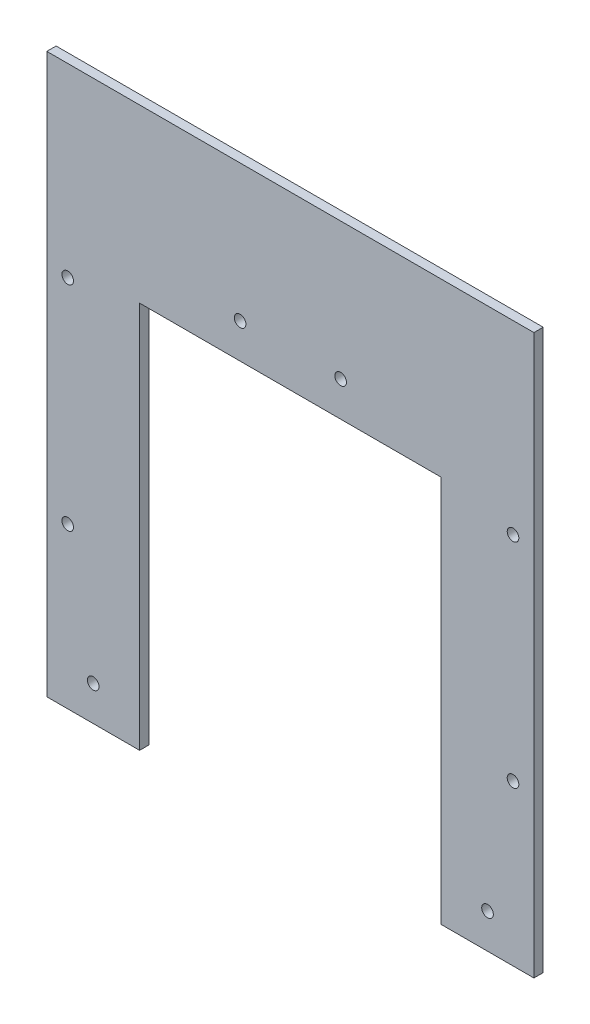
ISO-10303-21;
HEADER;
FILE_DESCRIPTION(('STEP AP214'),'2;1');
FILE_NAME('part.step','',(''),(''),'','','');
FILE_SCHEMA(('AUTOMOTIVE_DESIGN { 1 0 10303 214 1 1 1 1 }'));
ENDSEC;
DATA;
#1=APPLICATION_CONTEXT('core data for automotive mechanical design processes');
#2=APPLICATION_PROTOCOL_DEFINITION('international standard','automotive_design',2000,#1);
#3=PRODUCT_CONTEXT('',#1,'mechanical');
#4=PRODUCT('Part','Part','',(#3));
#5=PRODUCT_RELATED_PRODUCT_CATEGORY('part','',(#4));
#6=PRODUCT_DEFINITION_FORMATION('','',#4);
#7=PRODUCT_DEFINITION_CONTEXT('part definition',#1,'design');
#8=PRODUCT_DEFINITION('design','',#6,#7);
#9=PRODUCT_DEFINITION_SHAPE('','',#8);
#10=(LENGTH_UNIT() NAMED_UNIT(*) SI_UNIT(.MILLI.,.METRE.));
#11=(NAMED_UNIT(*) PLANE_ANGLE_UNIT() SI_UNIT($,.RADIAN.));
#12=(NAMED_UNIT(*) SI_UNIT($,.STERADIAN.) SOLID_ANGLE_UNIT());
#13=UNCERTAINTY_MEASURE_WITH_UNIT(LENGTH_MEASURE(1.E-05),#10,'distance_accuracy_value','');
#14=(GEOMETRIC_REPRESENTATION_CONTEXT(3) GLOBAL_UNCERTAINTY_ASSIGNED_CONTEXT((#13)) GLOBAL_UNIT_ASSIGNED_CONTEXT((#10,
#11,#12)) REPRESENTATION_CONTEXT('',''));
#15=CARTESIAN_POINT('',(0.,0.,0.));
#16=DIRECTION('',(0.,0.,1.));
#17=DIRECTION('',(1.,0.,0.));
#18=AXIS2_PLACEMENT_3D('',#15,#16,#17);
#19=CARTESIAN_POINT('',(0.,0.,4.));
#20=DIRECTION('',(0.,0.,-1.));
#21=DIRECTION('',(-1.,0.,0.));
#22=AXIS2_PLACEMENT_3D('',#19,#20,#21);
#23=PLANE('',#22);
#24=DIRECTION('',(0.,-1.,0.));
#25=VECTOR('',#24,1.);
#26=CARTESIAN_POINT('',(-100.,0.,4.));
#27=LINE('',#26,#25);
#28=CARTESIAN_POINT('',(-100.,241.,4.));
#29=VERTEX_POINT('',#28);
#30=CARTESIAN_POINT('',(-100.,0.,4.));
#31=VERTEX_POINT('',#30);
#32=EDGE_CURVE('E145',#29,#31,#27,.T.);
#33=ORIENTED_EDGE('',*,*,#32,.T.);
#34=DIRECTION('',(1.,0.,0.));
#35=VECTOR('',#34,1.);
#36=CARTESIAN_POINT('',(-100.,0.,4.));
#37=LINE('',#36,#35);
#38=CARTESIAN_POINT('',(-60.,0.,4.));
#39=VERTEX_POINT('',#38);
#40=EDGE_CURVE('E93',#31,#39,#37,.T.);
#41=ORIENTED_EDGE('',*,*,#40,.T.);
#42=DIRECTION('',(0.,1.,0.));
#43=VECTOR('',#42,1.);
#44=CARTESIAN_POINT('',(-60.,167.,4.));
#45=LINE('',#44,#43);
#46=CARTESIAN_POINT('',(-60.,167.,4.));
#47=VERTEX_POINT('',#46);
#48=EDGE_CURVE('E160',#39,#47,#45,.T.);
#49=ORIENTED_EDGE('',*,*,#48,.T.);
#50=DIRECTION('',(1.,0.,0.));
#51=VECTOR('',#50,1.);
#52=CARTESIAN_POINT('',(70.,167.,4.));
#53=LINE('',#52,#51);
#54=CARTESIAN_POINT('',(70.,167.,4.));
#55=VERTEX_POINT('',#54);
#56=EDGE_CURVE('E173',#47,#55,#53,.T.);
#57=ORIENTED_EDGE('',*,*,#56,.T.);
#58=DIRECTION('',(0.,-1.,0.));
#59=VECTOR('',#58,1.);
#60=CARTESIAN_POINT('',(70.,1.11022302462516E-13,4.));
#61=LINE('',#60,#59);
#62=CARTESIAN_POINT('',(70.,1.11022302462516E-13,4.));
#63=VERTEX_POINT('',#62);
#64=EDGE_CURVE('E112',#55,#63,#61,.T.);
#65=ORIENTED_EDGE('',*,*,#64,.T.);
#66=DIRECTION('',(1.,0.,0.));
#67=VECTOR('',#66,1.);
#68=CARTESIAN_POINT('',(70.,1.11022302462516E-13,4.));
#69=LINE('',#68,#67);
#70=CARTESIAN_POINT('',(110.,0.,4.));
#71=VERTEX_POINT('',#70);
#72=EDGE_CURVE('E106',#63,#71,#69,.T.);
#73=ORIENTED_EDGE('',*,*,#72,.T.);
#74=DIRECTION('',(0.,1.,0.));
#75=VECTOR('',#74,1.);
#76=CARTESIAN_POINT('',(110.,0.,4.));
#77=LINE('',#76,#75);
#78=CARTESIAN_POINT('',(110.,241.,4.));
#79=VERTEX_POINT('',#78);
#80=EDGE_CURVE('E110',#71,#79,#77,.T.);
#81=ORIENTED_EDGE('',*,*,#80,.T.);
#82=DIRECTION('',(-1.,0.,0.));
#83=VECTOR('',#82,1.);
#84=CARTESIAN_POINT('',(-100.,241.,4.));
#85=LINE('',#84,#83);
#86=EDGE_CURVE('E50',#79,#29,#85,.T.);
#87=ORIENTED_EDGE('',*,*,#86,.T.);
#88=EDGE_LOOP('',(#33,#41,#49,#57,#65,#73,#81,#87));
#89=FACE_BOUND('',#88,.T.);
#90=CARTESIAN_POINT('',(-80.,15.0000000000001,4.));
#91=DIRECTION('',(0.,0.,1.));
#92=DIRECTION('',(1.,0.,0.));
#93=AXIS2_PLACEMENT_3D('',#90,#91,#92);
#94=CIRCLE('',#93,2.50000000000001);
#95=CARTESIAN_POINT('',(-77.5,15.0000000000001,4.));
#96=VERTEX_POINT('',#95);
#97=EDGE_CURVE('E134',#96,#96,#94,.T.);
#98=ORIENTED_EDGE('',*,*,#97,.F.);
#99=EDGE_LOOP('',(#98));
#100=FACE_BOUND('',#99,.T.);
#101=CARTESIAN_POINT('',(-91.0000000000001,69.01,4.));
#102=DIRECTION('',(0.,0.,1.));
#103=DIRECTION('',(1.,0.,0.));
#104=AXIS2_PLACEMENT_3D('',#101,#102,#103);
#105=CIRCLE('',#104,2.5);
#106=CARTESIAN_POINT('',(-88.5000000000001,69.01,4.));
#107=VERTEX_POINT('',#106);
#108=EDGE_CURVE('E182',#107,#107,#105,.T.);
#109=ORIENTED_EDGE('',*,*,#108,.F.);
#110=EDGE_LOOP('',(#109));
#111=FACE_BOUND('',#110,.T.);
#112=CARTESIAN_POINT('',(-91.0000000000001,161.01,4.));
#113=DIRECTION('',(0.,0.,1.));
#114=DIRECTION('',(1.,0.,0.));
#115=AXIS2_PLACEMENT_3D('',#112,#113,#114);
#116=CIRCLE('',#115,2.49999999999997);
#117=CARTESIAN_POINT('',(-88.5000000000001,161.01,4.));
#118=VERTEX_POINT('',#117);
#119=EDGE_CURVE('E188',#118,#118,#116,.T.);
#120=ORIENTED_EDGE('',*,*,#119,.F.);
#121=EDGE_LOOP('',(#120));
#122=FACE_BOUND('',#121,.T.);
#123=CARTESIAN_POINT('',(-16.6666666666667,182.,4.));
#124=DIRECTION('',(0.,0.,1.));
#125=DIRECTION('',(1.,0.,0.));
#126=AXIS2_PLACEMENT_3D('',#123,#124,#125);
#127=CIRCLE('',#126,2.5);
#128=CARTESIAN_POINT('',(-14.1666666666667,182.,4.));
#129=VERTEX_POINT('',#128);
#130=EDGE_CURVE('E194',#129,#129,#127,.T.);
#131=ORIENTED_EDGE('',*,*,#130,.F.);
#132=EDGE_LOOP('',(#131));
#133=FACE_BOUND('',#132,.T.);
#134=CARTESIAN_POINT('',(26.6666666666667,182.,4.));
#135=DIRECTION('',(0.,0.,1.));
#136=DIRECTION('',(1.,0.,0.));
#137=AXIS2_PLACEMENT_3D('',#134,#135,#136);
#138=CIRCLE('',#137,2.5);
#139=CARTESIAN_POINT('',(29.1666666666667,182.,4.));
#140=VERTEX_POINT('',#139);
#141=EDGE_CURVE('E200',#140,#140,#138,.T.);
#142=ORIENTED_EDGE('',*,*,#141,.F.);
#143=EDGE_LOOP('',(#142));
#144=FACE_BOUND('',#143,.T.);
#145=CARTESIAN_POINT('',(101.,161.01,4.));
#146=DIRECTION('',(0.,0.,1.));
#147=DIRECTION('',(1.,0.,0.));
#148=AXIS2_PLACEMENT_3D('',#145,#146,#147);
#149=CIRCLE('',#148,2.5);
#150=CARTESIAN_POINT('',(103.5,161.01,4.));
#151=VERTEX_POINT('',#150);
#152=EDGE_CURVE('E206',#151,#151,#149,.T.);
#153=ORIENTED_EDGE('',*,*,#152,.F.);
#154=EDGE_LOOP('',(#153));
#155=FACE_BOUND('',#154,.T.);
#156=CARTESIAN_POINT('',(101.,69.01,4.));
#157=DIRECTION('',(0.,0.,1.));
#158=DIRECTION('',(1.,0.,0.));
#159=AXIS2_PLACEMENT_3D('',#156,#157,#158);
#160=CIRCLE('',#159,2.50000000000007);
#161=CARTESIAN_POINT('',(103.5,69.01,4.));
#162=VERTEX_POINT('',#161);
#163=EDGE_CURVE('E212',#162,#162,#160,.T.);
#164=ORIENTED_EDGE('',*,*,#163,.F.);
#165=EDGE_LOOP('',(#164));
#166=FACE_BOUND('',#165,.T.);
#167=CARTESIAN_POINT('',(90.,15.,4.));
#168=DIRECTION('',(0.,0.,1.));
#169=DIRECTION('',(1.,0.,0.));
#170=AXIS2_PLACEMENT_3D('',#167,#168,#169);
#171=CIRCLE('',#170,2.50000000000001);
#172=CARTESIAN_POINT('',(92.5,15.,4.));
#173=VERTEX_POINT('',#172);
#174=EDGE_CURVE('E218',#173,#173,#171,.T.);
#175=ORIENTED_EDGE('',*,*,#174,.F.);
#176=EDGE_LOOP('',(#175));
#177=FACE_BOUND('',#176,.T.);
#178=ADVANCED_FACE('F33',(#89,#100,#111,#122,#133,#144,#155,#166,#177),#23,.F.);
#179=CARTESIAN_POINT('',(0.,0.,0.));
#180=DIRECTION('',(0.,0.,-1.));
#181=DIRECTION('',(-1.,0.,0.));
#182=AXIS2_PLACEMENT_3D('',#179,#180,#181);
#183=PLANE('',#182);
#184=CARTESIAN_POINT('',(101.,69.01,0.));
#185=DIRECTION('',(0.,0.,1.));
#186=DIRECTION('',(1.,0.,0.));
#187=AXIS2_PLACEMENT_3D('',#184,#185,#186);
#188=CIRCLE('',#187,2.50000000000007);
#189=CARTESIAN_POINT('',(103.5,69.01,0.));
#190=VERTEX_POINT('',#189);
#191=EDGE_CURVE('E215',#190,#190,#188,.T.);
#192=ORIENTED_EDGE('',*,*,#191,.T.);
#193=EDGE_LOOP('',(#192));
#194=FACE_BOUND('',#193,.T.);
#195=CARTESIAN_POINT('',(26.6666666666667,182.,0.));
#196=DIRECTION('',(0.,0.,1.));
#197=DIRECTION('',(1.,0.,0.));
#198=AXIS2_PLACEMENT_3D('',#195,#196,#197);
#199=CIRCLE('',#198,2.5);
#200=CARTESIAN_POINT('',(29.1666666666667,182.,0.));
#201=VERTEX_POINT('',#200);
#202=EDGE_CURVE('E203',#201,#201,#199,.T.);
#203=ORIENTED_EDGE('',*,*,#202,.T.);
#204=EDGE_LOOP('',(#203));
#205=FACE_BOUND('',#204,.T.);
#206=CARTESIAN_POINT('',(-91.0000000000001,161.01,0.));
#207=DIRECTION('',(0.,0.,1.));
#208=DIRECTION('',(1.,0.,0.));
#209=AXIS2_PLACEMENT_3D('',#206,#207,#208);
#210=CIRCLE('',#209,2.49999999999997);
#211=CARTESIAN_POINT('',(-88.5000000000001,161.01,0.));
#212=VERTEX_POINT('',#211);
#213=EDGE_CURVE('E191',#212,#212,#210,.T.);
#214=ORIENTED_EDGE('',*,*,#213,.T.);
#215=EDGE_LOOP('',(#214));
#216=FACE_BOUND('',#215,.T.);
#217=CARTESIAN_POINT('',(-80.,15.0000000000001,0.));
#218=DIRECTION('',(0.,0.,1.));
#219=DIRECTION('',(1.,0.,0.));
#220=AXIS2_PLACEMENT_3D('',#217,#218,#219);
#221=CIRCLE('',#220,2.50000000000001);
#222=CARTESIAN_POINT('',(-77.5,15.0000000000001,0.));
#223=VERTEX_POINT('',#222);
#224=EDGE_CURVE('E179',#223,#223,#221,.T.);
#225=ORIENTED_EDGE('',*,*,#224,.T.);
#226=EDGE_LOOP('',(#225));
#227=FACE_BOUND('',#226,.T.);
#228=DIRECTION('',(0.,-1.,0.));
#229=VECTOR('',#228,1.);
#230=CARTESIAN_POINT('',(-100.,0.,0.));
#231=LINE('',#230,#229);
#232=CARTESIAN_POINT('',(-100.,241.,0.));
#233=VERTEX_POINT('',#232);
#234=CARTESIAN_POINT('',(-100.,0.,0.));
#235=VERTEX_POINT('',#234);
#236=EDGE_CURVE('E130',#233,#235,#231,.T.);
#237=ORIENTED_EDGE('',*,*,#236,.F.);
#238=DIRECTION('',(-1.,0.,0.));
#239=VECTOR('',#238,1.);
#240=CARTESIAN_POINT('',(-100.,241.,0.));
#241=LINE('',#240,#239);
#242=CARTESIAN_POINT('',(110.,241.,0.));
#243=VERTEX_POINT('',#242);
#244=EDGE_CURVE('E85',#243,#233,#241,.T.);
#245=ORIENTED_EDGE('',*,*,#244,.F.);
#246=DIRECTION('',(0.,1.,0.));
#247=VECTOR('',#246,1.);
#248=CARTESIAN_POINT('',(110.,0.,0.));
#249=LINE('',#248,#247);
#250=CARTESIAN_POINT('',(110.,0.,0.));
#251=VERTEX_POINT('',#250);
#252=EDGE_CURVE('E79',#251,#243,#249,.T.);
#253=ORIENTED_EDGE('',*,*,#252,.F.);
#254=DIRECTION('',(1.,0.,0.));
#255=VECTOR('',#254,1.);
#256=CARTESIAN_POINT('',(70.,1.11022302462516E-13,0.));
#257=LINE('',#256,#255);
#258=CARTESIAN_POINT('',(70.,1.11022302462516E-13,0.));
#259=VERTEX_POINT('',#258);
#260=EDGE_CURVE('E120',#259,#251,#257,.T.);
#261=ORIENTED_EDGE('',*,*,#260,.F.);
#262=DIRECTION('',(0.,-1.,0.));
#263=VECTOR('',#262,1.);
#264=CARTESIAN_POINT('',(70.,1.11022302462516E-13,0.));
#265=LINE('',#264,#263);
#266=CARTESIAN_POINT('',(70.,167.,0.));
#267=VERTEX_POINT('',#266);
#268=EDGE_CURVE('E140',#267,#259,#265,.T.);
#269=ORIENTED_EDGE('',*,*,#268,.F.);
#270=DIRECTION('',(1.,0.,0.));
#271=VECTOR('',#270,1.);
#272=CARTESIAN_POINT('',(70.,167.,0.));
#273=LINE('',#272,#271);
#274=CARTESIAN_POINT('',(-60.,167.,0.));
#275=VERTEX_POINT('',#274);
#276=EDGE_CURVE('E138',#275,#267,#273,.T.);
#277=ORIENTED_EDGE('',*,*,#276,.F.);
#278=DIRECTION('',(0.,1.,0.));
#279=VECTOR('',#278,1.);
#280=CARTESIAN_POINT('',(-60.,167.,0.));
#281=LINE('',#280,#279);
#282=CARTESIAN_POINT('',(-60.,0.,0.));
#283=VERTEX_POINT('',#282);
#284=EDGE_CURVE('E136',#283,#275,#281,.T.);
#285=ORIENTED_EDGE('',*,*,#284,.F.);
#286=DIRECTION('',(1.,0.,0.));
#287=VECTOR('',#286,1.);
#288=CARTESIAN_POINT('',(-100.,0.,0.));
#289=LINE('',#288,#287);
#290=EDGE_CURVE('E133',#235,#283,#289,.T.);
#291=ORIENTED_EDGE('',*,*,#290,.F.);
#292=EDGE_LOOP('',(#237,#245,#253,#261,#269,#277,#285,#291));
#293=FACE_BOUND('',#292,.T.);
#294=CARTESIAN_POINT('',(-91.0000000000001,69.01,0.));
#295=DIRECTION('',(0.,0.,1.));
#296=DIRECTION('',(1.,0.,0.));
#297=AXIS2_PLACEMENT_3D('',#294,#295,#296);
#298=CIRCLE('',#297,2.5);
#299=CARTESIAN_POINT('',(-88.5000000000001,69.01,0.));
#300=VERTEX_POINT('',#299);
#301=EDGE_CURVE('E185',#300,#300,#298,.T.);
#302=ORIENTED_EDGE('',*,*,#301,.T.);
#303=EDGE_LOOP('',(#302));
#304=FACE_BOUND('',#303,.T.);
#305=CARTESIAN_POINT('',(-16.6666666666667,182.,0.));
#306=DIRECTION('',(0.,0.,1.));
#307=DIRECTION('',(1.,0.,0.));
#308=AXIS2_PLACEMENT_3D('',#305,#306,#307);
#309=CIRCLE('',#308,2.5);
#310=CARTESIAN_POINT('',(-14.1666666666667,182.,0.));
#311=VERTEX_POINT('',#310);
#312=EDGE_CURVE('E197',#311,#311,#309,.T.);
#313=ORIENTED_EDGE('',*,*,#312,.T.);
#314=EDGE_LOOP('',(#313));
#315=FACE_BOUND('',#314,.T.);
#316=CARTESIAN_POINT('',(101.,161.01,0.));
#317=DIRECTION('',(0.,0.,1.));
#318=DIRECTION('',(1.,0.,0.));
#319=AXIS2_PLACEMENT_3D('',#316,#317,#318);
#320=CIRCLE('',#319,2.5);
#321=CARTESIAN_POINT('',(103.5,161.01,0.));
#322=VERTEX_POINT('',#321);
#323=EDGE_CURVE('E209',#322,#322,#320,.T.);
#324=ORIENTED_EDGE('',*,*,#323,.T.);
#325=EDGE_LOOP('',(#324));
#326=FACE_BOUND('',#325,.T.);
#327=CARTESIAN_POINT('',(90.,15.,0.));
#328=DIRECTION('',(0.,0.,1.));
#329=DIRECTION('',(1.,0.,0.));
#330=AXIS2_PLACEMENT_3D('',#327,#328,#329);
#331=CIRCLE('',#330,2.50000000000001);
#332=CARTESIAN_POINT('',(92.5,15.,0.));
#333=VERTEX_POINT('',#332);
#334=EDGE_CURVE('E221',#333,#333,#331,.T.);
#335=ORIENTED_EDGE('',*,*,#334,.T.);
#336=EDGE_LOOP('',(#335));
#337=FACE_BOUND('',#336,.T.);
#338=ADVANCED_FACE('F164',(#194,#205,#216,#227,#293,#304,#315,#326,#337),#183,.T.);
#339=CARTESIAN_POINT('',(-100.,0.,4.));
#340=DIRECTION('',(1.,0.,0.));
#341=DIRECTION('',(0.,0.,-1.));
#342=AXIS2_PLACEMENT_3D('',#339,#340,#341);
#343=PLANE('',#342);
#344=ORIENTED_EDGE('',*,*,#236,.T.);
#345=DIRECTION('',(0.,0.,-1.));
#346=VECTOR('',#345,1.);
#347=CARTESIAN_POINT('',(-100.,0.,4.));
#348=LINE('',#347,#346);
#349=EDGE_CURVE('E11',#31,#235,#348,.T.);
#350=ORIENTED_EDGE('',*,*,#349,.F.);
#351=ORIENTED_EDGE('',*,*,#32,.F.);
#352=DIRECTION('',(0.,0.,-1.));
#353=VECTOR('',#352,1.);
#354=CARTESIAN_POINT('',(-100.,241.,4.));
#355=LINE('',#354,#353);
#356=EDGE_CURVE('E126',#29,#233,#355,.T.);
#357=ORIENTED_EDGE('',*,*,#356,.T.);
#358=EDGE_LOOP('',(#344,#350,#351,#357));
#359=FACE_BOUND('',#358,.T.);
#360=ADVANCED_FACE('F35',(#359),#343,.F.);
#361=CARTESIAN_POINT('',(-100.,0.,4.));
#362=DIRECTION('',(0.,1.,0.));
#363=DIRECTION('',(0.,0.,1.));
#364=AXIS2_PLACEMENT_3D('',#361,#362,#363);
#365=PLANE('',#364);
#366=ORIENTED_EDGE('',*,*,#290,.T.);
#367=DIRECTION('',(0.,0.,-1.));
#368=VECTOR('',#367,1.);
#369=CARTESIAN_POINT('',(-60.,0.,4.));
#370=LINE('',#369,#368);
#371=EDGE_CURVE('E42',#39,#283,#370,.T.);
#372=ORIENTED_EDGE('',*,*,#371,.F.);
#373=ORIENTED_EDGE('',*,*,#40,.F.);
#374=ORIENTED_EDGE('',*,*,#349,.T.);
#375=EDGE_LOOP('',(#366,#372,#373,#374));
#376=FACE_BOUND('',#375,.T.);
#377=ADVANCED_FACE('F253',(#376),#365,.F.);
#378=CARTESIAN_POINT('',(-60.,167.,4.));
#379=DIRECTION('',(-1.,0.,0.));
#380=DIRECTION('',(0.,-1.,0.));
#381=AXIS2_PLACEMENT_3D('',#378,#379,#380);
#382=PLANE('',#381);
#383=ORIENTED_EDGE('',*,*,#284,.T.);
#384=DIRECTION('',(0.,0.,-1.));
#385=VECTOR('',#384,1.);
#386=CARTESIAN_POINT('',(-60.,167.,4.));
#387=LINE('',#386,#385);
#388=EDGE_CURVE('E152',#47,#275,#387,.T.);
#389=ORIENTED_EDGE('',*,*,#388,.F.);
#390=ORIENTED_EDGE('',*,*,#48,.F.);
#391=ORIENTED_EDGE('',*,*,#371,.T.);
#392=EDGE_LOOP('',(#383,#389,#390,#391));
#393=FACE_BOUND('',#392,.T.);
#394=ADVANCED_FACE('F158',(#393),#382,.F.);
#395=CARTESIAN_POINT('',(70.,167.,4.));
#396=DIRECTION('',(0.,1.,0.));
#397=DIRECTION('',(0.,0.,1.));
#398=AXIS2_PLACEMENT_3D('',#395,#396,#397);
#399=PLANE('',#398);
#400=ORIENTED_EDGE('',*,*,#276,.T.);
#401=DIRECTION('',(0.,0.,-1.));
#402=VECTOR('',#401,1.);
#403=CARTESIAN_POINT('',(70.,167.,4.));
#404=LINE('',#403,#402);
#405=EDGE_CURVE('E149',#55,#267,#404,.T.);
#406=ORIENTED_EDGE('',*,*,#405,.F.);
#407=ORIENTED_EDGE('',*,*,#56,.F.);
#408=ORIENTED_EDGE('',*,*,#388,.T.);
#409=EDGE_LOOP('',(#400,#406,#407,#408));
#410=FACE_BOUND('',#409,.T.);
#411=ADVANCED_FACE('F169',(#410),#399,.F.);
#412=CARTESIAN_POINT('',(70.,1.11022302462516E-13,4.));
#413=DIRECTION('',(1.,0.,0.));
#414=DIRECTION('',(0.,0.,-1.));
#415=AXIS2_PLACEMENT_3D('',#412,#413,#414);
#416=PLANE('',#415);
#417=ORIENTED_EDGE('',*,*,#268,.T.);
#418=DIRECTION('',(0.,0.,-1.));
#419=VECTOR('',#418,1.);
#420=CARTESIAN_POINT('',(70.,1.11022302462516E-13,4.));
#421=LINE('',#420,#419);
#422=EDGE_CURVE('E121',#63,#259,#421,.T.);
#423=ORIENTED_EDGE('',*,*,#422,.F.);
#424=ORIENTED_EDGE('',*,*,#64,.F.);
#425=ORIENTED_EDGE('',*,*,#405,.T.);
#426=EDGE_LOOP('',(#417,#423,#424,#425));
#427=FACE_BOUND('',#426,.T.);
#428=ADVANCED_FACE('F172',(#427),#416,.F.);
#429=CARTESIAN_POINT('',(70.,1.11022302462516E-13,4.));
#430=DIRECTION('',(0.,1.,0.));
#431=DIRECTION('',(-1.,0.,0.));
#432=AXIS2_PLACEMENT_3D('',#429,#430,#431);
#433=PLANE('',#432);
#434=ORIENTED_EDGE('',*,*,#260,.T.);
#435=DIRECTION('',(0.,0.,-1.));
#436=VECTOR('',#435,1.);
#437=CARTESIAN_POINT('',(110.,0.,4.));
#438=LINE('',#437,#436);
#439=EDGE_CURVE('E117',#71,#251,#438,.T.);
#440=ORIENTED_EDGE('',*,*,#439,.F.);
#441=ORIENTED_EDGE('',*,*,#72,.F.);
#442=ORIENTED_EDGE('',*,*,#422,.T.);
#443=EDGE_LOOP('',(#434,#440,#441,#442));
#444=FACE_BOUND('',#443,.T.);
#445=ADVANCED_FACE('F118',(#444),#433,.F.);
#446=CARTESIAN_POINT('',(110.,0.,4.));
#447=DIRECTION('',(-1.,0.,0.));
#448=DIRECTION('',(0.,0.,1.));
#449=AXIS2_PLACEMENT_3D('',#446,#447,#448);
#450=PLANE('',#449);
#451=ORIENTED_EDGE('',*,*,#252,.T.);
#452=DIRECTION('',(0.,0.,-1.));
#453=VECTOR('',#452,1.);
#454=CARTESIAN_POINT('',(110.,241.,4.));
#455=LINE('',#454,#453);
#456=EDGE_CURVE('E122',#79,#243,#455,.T.);
#457=ORIENTED_EDGE('',*,*,#456,.F.);
#458=ORIENTED_EDGE('',*,*,#80,.F.);
#459=ORIENTED_EDGE('',*,*,#439,.T.);
#460=EDGE_LOOP('',(#451,#457,#458,#459));
#461=FACE_BOUND('',#460,.T.);
#462=ADVANCED_FACE('F124',(#461),#450,.F.);
#463=CARTESIAN_POINT('',(-100.,241.,4.));
#464=DIRECTION('',(0.,-1.,0.));
#465=DIRECTION('',(0.,0.,-1.));
#466=AXIS2_PLACEMENT_3D('',#463,#464,#465);
#467=PLANE('',#466);
#468=ORIENTED_EDGE('',*,*,#244,.T.);
#469=ORIENTED_EDGE('',*,*,#356,.F.);
#470=ORIENTED_EDGE('',*,*,#86,.F.);
#471=ORIENTED_EDGE('',*,*,#456,.T.);
#472=EDGE_LOOP('',(#468,#469,#470,#471));
#473=FACE_BOUND('',#472,.T.);
#474=ADVANCED_FACE('F241',(#473),#467,.F.);
#475=CARTESIAN_POINT('',(-80.,15.0000000000001,4.));
#476=DIRECTION('',(0.,0.,-1.));
#477=DIRECTION('',(-1.,0.,0.));
#478=AXIS2_PLACEMENT_3D('',#475,#476,#477);
#479=CYLINDRICAL_SURFACE('',#478,2.50000000000001);
#480=ORIENTED_EDGE('',*,*,#97,.T.);
#481=EDGE_LOOP('',(#480));
#482=FACE_BOUND('',#481,.T.);
#483=ORIENTED_EDGE('',*,*,#224,.F.);
#484=EDGE_LOOP('',(#483));
#485=FACE_BOUND('',#484,.T.);
#486=ADVANCED_FACE('F238',(#482,#485),#479,.F.);
#487=CARTESIAN_POINT('',(-91.0000000000001,69.01,4.));
#488=DIRECTION('',(0.,0.,-1.));
#489=DIRECTION('',(-1.,0.,0.));
#490=AXIS2_PLACEMENT_3D('',#487,#488,#489);
#491=CYLINDRICAL_SURFACE('',#490,2.5);
#492=ORIENTED_EDGE('',*,*,#108,.T.);
#493=EDGE_LOOP('',(#492));
#494=FACE_BOUND('',#493,.T.);
#495=ORIENTED_EDGE('',*,*,#301,.F.);
#496=EDGE_LOOP('',(#495));
#497=FACE_BOUND('',#496,.T.);
#498=ADVANCED_FACE('F317',(#494,#497),#491,.F.);
#499=CARTESIAN_POINT('',(-91.0000000000001,161.01,4.));
#500=DIRECTION('',(0.,0.,-1.));
#501=DIRECTION('',(-1.,0.,0.));
#502=AXIS2_PLACEMENT_3D('',#499,#500,#501);
#503=CYLINDRICAL_SURFACE('',#502,2.49999999999997);
#504=ORIENTED_EDGE('',*,*,#119,.T.);
#505=EDGE_LOOP('',(#504));
#506=FACE_BOUND('',#505,.T.);
#507=ORIENTED_EDGE('',*,*,#213,.F.);
#508=EDGE_LOOP('',(#507));
#509=FACE_BOUND('',#508,.T.);
#510=ADVANCED_FACE('F325',(#506,#509),#503,.F.);
#511=CARTESIAN_POINT('',(-16.6666666666667,182.,4.));
#512=DIRECTION('',(0.,0.,-1.));
#513=DIRECTION('',(-1.,0.,0.));
#514=AXIS2_PLACEMENT_3D('',#511,#512,#513);
#515=CYLINDRICAL_SURFACE('',#514,2.5);
#516=ORIENTED_EDGE('',*,*,#130,.T.);
#517=EDGE_LOOP('',(#516));
#518=FACE_BOUND('',#517,.T.);
#519=ORIENTED_EDGE('',*,*,#312,.F.);
#520=EDGE_LOOP('',(#519));
#521=FACE_BOUND('',#520,.T.);
#522=ADVANCED_FACE('F333',(#518,#521),#515,.F.);
#523=CARTESIAN_POINT('',(26.6666666666667,182.,4.));
#524=DIRECTION('',(0.,0.,-1.));
#525=DIRECTION('',(-1.,0.,0.));
#526=AXIS2_PLACEMENT_3D('',#523,#524,#525);
#527=CYLINDRICAL_SURFACE('',#526,2.5);
#528=ORIENTED_EDGE('',*,*,#141,.T.);
#529=EDGE_LOOP('',(#528));
#530=FACE_BOUND('',#529,.T.);
#531=ORIENTED_EDGE('',*,*,#202,.F.);
#532=EDGE_LOOP('',(#531));
#533=FACE_BOUND('',#532,.T.);
#534=ADVANCED_FACE('F342',(#530,#533),#527,.F.);
#535=CARTESIAN_POINT('',(101.,161.01,4.));
#536=DIRECTION('',(0.,0.,-1.));
#537=DIRECTION('',(-1.,0.,0.));
#538=AXIS2_PLACEMENT_3D('',#535,#536,#537);
#539=CYLINDRICAL_SURFACE('',#538,2.5);
#540=ORIENTED_EDGE('',*,*,#152,.T.);
#541=EDGE_LOOP('',(#540));
#542=FACE_BOUND('',#541,.T.);
#543=ORIENTED_EDGE('',*,*,#323,.F.);
#544=EDGE_LOOP('',(#543));
#545=FACE_BOUND('',#544,.T.);
#546=ADVANCED_FACE('F351',(#542,#545),#539,.F.);
#547=CARTESIAN_POINT('',(101.,69.01,4.));
#548=DIRECTION('',(0.,0.,-1.));
#549=DIRECTION('',(-1.,0.,0.));
#550=AXIS2_PLACEMENT_3D('',#547,#548,#549);
#551=CYLINDRICAL_SURFACE('',#550,2.50000000000007);
#552=ORIENTED_EDGE('',*,*,#163,.T.);
#553=EDGE_LOOP('',(#552));
#554=FACE_BOUND('',#553,.T.);
#555=ORIENTED_EDGE('',*,*,#191,.F.);
#556=EDGE_LOOP('',(#555));
#557=FACE_BOUND('',#556,.T.);
#558=ADVANCED_FACE('F360',(#554,#557),#551,.F.);
#559=CARTESIAN_POINT('',(90.,15.,4.));
#560=DIRECTION('',(0.,0.,-1.));
#561=DIRECTION('',(-1.,0.,0.));
#562=AXIS2_PLACEMENT_3D('',#559,#560,#561);
#563=CYLINDRICAL_SURFACE('',#562,2.50000000000001);
#564=ORIENTED_EDGE('',*,*,#174,.T.);
#565=EDGE_LOOP('',(#564));
#566=FACE_BOUND('',#565,.T.);
#567=ORIENTED_EDGE('',*,*,#334,.F.);
#568=EDGE_LOOP('',(#567));
#569=FACE_BOUND('',#568,.T.);
#570=ADVANCED_FACE('F227',(#566,#569),#563,.F.);
#571=CLOSED_SHELL('',(#178,#338,#360,#377,#394,#411,#428,#445,#462,#474,#486,#498,#510,#522,
#534,#546,#558,#570));
#572=MANIFOLD_SOLID_BREP('B2',#571);
#573=ADVANCED_BREP_SHAPE_REPRESENTATION('',(#18,#572),#14);
#574=SHAPE_DEFINITION_REPRESENTATION(#9,#573);
ENDSEC;
END-ISO-10303-21;
